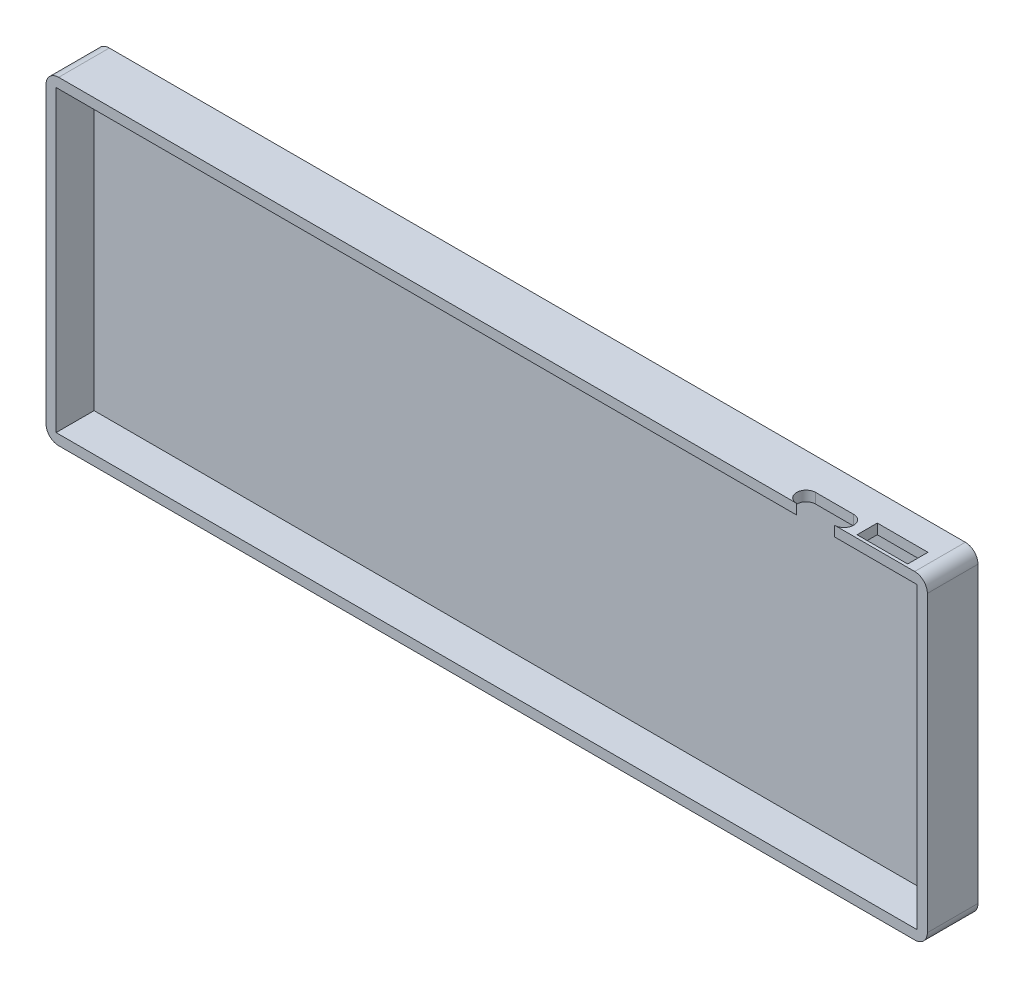
ISO-10303-21;
HEADER;
FILE_DESCRIPTION(('STEP AP214'),'2;1');
FILE_NAME('part.step','',(''),(''),'','','');
FILE_SCHEMA(('AUTOMOTIVE_DESIGN { 1 0 10303 214 1 1 1 1 }'));
ENDSEC;
DATA;
#1=APPLICATION_CONTEXT('core data for automotive mechanical design processes');
#2=APPLICATION_PROTOCOL_DEFINITION('international standard','automotive_design',2000,#1);
#3=PRODUCT_CONTEXT('',#1,'mechanical');
#4=PRODUCT('Part','Part','',(#3));
#5=PRODUCT_RELATED_PRODUCT_CATEGORY('part','',(#4));
#6=PRODUCT_DEFINITION_FORMATION('','',#4);
#7=PRODUCT_DEFINITION_CONTEXT('part definition',#1,'design');
#8=PRODUCT_DEFINITION('design','',#6,#7);
#9=PRODUCT_DEFINITION_SHAPE('','',#8);
#10=(LENGTH_UNIT() NAMED_UNIT(*) SI_UNIT(.MILLI.,.METRE.));
#11=(NAMED_UNIT(*) PLANE_ANGLE_UNIT() SI_UNIT($,.RADIAN.));
#12=(NAMED_UNIT(*) SI_UNIT($,.STERADIAN.) SOLID_ANGLE_UNIT());
#13=UNCERTAINTY_MEASURE_WITH_UNIT(LENGTH_MEASURE(1.E-05),#10,'distance_accuracy_value','');
#14=(GEOMETRIC_REPRESENTATION_CONTEXT(3) GLOBAL_UNCERTAINTY_ASSIGNED_CONTEXT((#13)) GLOBAL_UNIT_ASSIGNED_CONTEXT((#10,
#11,#12)) REPRESENTATION_CONTEXT('',''));
#15=CARTESIAN_POINT('',(0.,0.,0.));
#16=DIRECTION('',(0.,0.,1.));
#17=DIRECTION('',(1.,0.,0.));
#18=AXIS2_PLACEMENT_3D('',#15,#16,#17);
#19=CARTESIAN_POINT('',(-174.,63.,20.));
#20=DIRECTION('',(1.,0.,0.));
#21=DIRECTION('',(0.,1.,0.));
#22=AXIS2_PLACEMENT_3D('',#19,#20,#21);
#23=PLANE('',#22);
#24=DIRECTION('',(0.,-1.,0.));
#25=VECTOR('',#24,1.);
#26=CARTESIAN_POINT('',(-174.,63.,20.));
#27=LINE('',#26,#25);
#28=CARTESIAN_POINT('',(-174.,58.,20.));
#29=VERTEX_POINT('',#28);
#30=CARTESIAN_POINT('',(-174.,-58.,20.));
#31=VERTEX_POINT('',#30);
#32=EDGE_CURVE('E281',#29,#31,#27,.T.);
#33=ORIENTED_EDGE('',*,*,#32,.F.);
#34=DIRECTION('',(0.,0.,-1.));
#35=VECTOR('',#34,1.);
#36=CARTESIAN_POINT('',(-174.,58.,20.));
#37=LINE('',#36,#35);
#38=CARTESIAN_POINT('',(-174.,58.,0.));
#39=VERTEX_POINT('',#38);
#40=EDGE_CURVE('E303',#29,#39,#37,.T.);
#41=ORIENTED_EDGE('',*,*,#40,.T.);
#42=DIRECTION('',(0.,-1.,0.));
#43=VECTOR('',#42,1.);
#44=CARTESIAN_POINT('',(-174.,63.,0.));
#45=LINE('',#44,#43);
#46=CARTESIAN_POINT('',(-174.,-58.,0.));
#47=VERTEX_POINT('',#46);
#48=EDGE_CURVE('E274',#39,#47,#45,.T.);
#49=ORIENTED_EDGE('',*,*,#48,.T.);
#50=DIRECTION('',(0.,0.,-1.));
#51=VECTOR('',#50,1.);
#52=CARTESIAN_POINT('',(-174.,-58.,20.));
#53=LINE('',#52,#51);
#54=EDGE_CURVE('E292',#47,#31,#53,.F.);
#55=ORIENTED_EDGE('',*,*,#54,.T.);
#56=EDGE_LOOP('',(#33,#41,#49,#55));
#57=FACE_BOUND('',#56,.T.);
#58=ADVANCED_FACE('F39',(#57),#23,.F.);
#59=CARTESIAN_POINT('',(174.,-63.,20.));
#60=DIRECTION('',(0.,1.,0.));
#61=DIRECTION('',(-1.,0.,0.));
#62=AXIS2_PLACEMENT_3D('',#59,#60,#61);
#63=PLANE('',#62);
#64=DIRECTION('',(1.,0.,0.));
#65=VECTOR('',#64,1.);
#66=CARTESIAN_POINT('',(174.,-63.,20.));
#67=LINE('',#66,#65);
#68=CARTESIAN_POINT('',(-169.,-63.,20.));
#69=VERTEX_POINT('',#68);
#70=CARTESIAN_POINT('',(169.,-63.,20.));
#71=VERTEX_POINT('',#70);
#72=EDGE_CURVE('E284',#69,#71,#67,.T.);
#73=ORIENTED_EDGE('',*,*,#72,.F.);
#74=DIRECTION('',(0.,0.,-1.));
#75=VECTOR('',#74,1.);
#76=CARTESIAN_POINT('',(-169.,-63.,20.));
#77=LINE('',#76,#75);
#78=CARTESIAN_POINT('',(-169.,-63.,0.));
#79=VERTEX_POINT('',#78);
#80=EDGE_CURVE('E328',#69,#79,#77,.T.);
#81=ORIENTED_EDGE('',*,*,#80,.T.);
#82=DIRECTION('',(1.,0.,0.));
#83=VECTOR('',#82,1.);
#84=CARTESIAN_POINT('',(174.,-63.,0.));
#85=LINE('',#84,#83);
#86=CARTESIAN_POINT('',(169.,-63.,0.));
#87=VERTEX_POINT('',#86);
#88=EDGE_CURVE('E295',#79,#87,#85,.T.);
#89=ORIENTED_EDGE('',*,*,#88,.T.);
#90=DIRECTION('',(0.,0.,-1.));
#91=VECTOR('',#90,1.);
#92=CARTESIAN_POINT('',(169.,-63.,20.));
#93=LINE('',#92,#91);
#94=EDGE_CURVE('E326',#87,#71,#93,.F.);
#95=ORIENTED_EDGE('',*,*,#94,.T.);
#96=EDGE_LOOP('',(#73,#81,#89,#95));
#97=FACE_BOUND('',#96,.T.);
#98=ADVANCED_FACE('F334',(#97),#63,.F.);
#99=CARTESIAN_POINT('',(174.,63.,20.));
#100=DIRECTION('',(-1.,0.,0.));
#101=DIRECTION('',(0.,0.,1.));
#102=AXIS2_PLACEMENT_3D('',#99,#100,#101);
#103=PLANE('',#102);
#104=DIRECTION('',(0.,1.,0.));
#105=VECTOR('',#104,1.);
#106=CARTESIAN_POINT('',(174.,63.,20.));
#107=LINE('',#106,#105);
#108=CARTESIAN_POINT('',(174.,-58.,20.));
#109=VERTEX_POINT('',#108);
#110=CARTESIAN_POINT('',(174.,58.,20.));
#111=VERTEX_POINT('',#110);
#112=EDGE_CURVE('E287',#109,#111,#107,.T.);
#113=ORIENTED_EDGE('',*,*,#112,.F.);
#114=DIRECTION('',(0.,0.,-1.));
#115=VECTOR('',#114,1.);
#116=CARTESIAN_POINT('',(174.,-58.,20.));
#117=LINE('',#116,#115);
#118=CARTESIAN_POINT('',(174.,-58.,0.));
#119=VERTEX_POINT('',#118);
#120=EDGE_CURVE('E11',#109,#119,#117,.T.);
#121=ORIENTED_EDGE('',*,*,#120,.T.);
#122=DIRECTION('',(0.,1.,0.));
#123=VECTOR('',#122,1.);
#124=CARTESIAN_POINT('',(174.,63.,0.));
#125=LINE('',#124,#123);
#126=CARTESIAN_POINT('',(174.,58.,0.));
#127=VERTEX_POINT('',#126);
#128=EDGE_CURVE('E298',#119,#127,#125,.T.);
#129=ORIENTED_EDGE('',*,*,#128,.T.);
#130=DIRECTION('',(0.,0.,-1.));
#131=VECTOR('',#130,1.);
#132=CARTESIAN_POINT('',(174.,58.,20.));
#133=LINE('',#132,#131);
#134=EDGE_CURVE('E47',#127,#111,#133,.F.);
#135=ORIENTED_EDGE('',*,*,#134,.T.);
#136=EDGE_LOOP('',(#113,#121,#129,#135));
#137=FACE_BOUND('',#136,.T.);
#138=ADVANCED_FACE('F345',(#137),#103,.F.);
#139=CARTESIAN_POINT('',(174.,63.,20.));
#140=DIRECTION('',(0.,-1.,0.));
#141=DIRECTION('',(1.,0.,0.));
#142=AXIS2_PLACEMENT_3D('',#139,#140,#141);
#143=PLANE('',#142);
#144=DIRECTION('',(1.,0.,0.));
#145=VECTOR('',#144,1.);
#146=CARTESIAN_POINT('',(145.05,63.,18.81));
#147=LINE('',#146,#145);
#148=CARTESIAN_POINT('',(145.05,63.,18.81));
#149=VERTEX_POINT('',#148);
#150=CARTESIAN_POINT('',(165.05,63.,18.81));
#151=VERTEX_POINT('',#150);
#152=EDGE_CURVE('E205',#149,#151,#147,.T.);
#153=ORIENTED_EDGE('',*,*,#152,.F.);
#154=DIRECTION('',(0.,0.,1.));
#155=VECTOR('',#154,1.);
#156=CARTESIAN_POINT('',(145.05,63.,10.81));
#157=LINE('',#156,#155);
#158=CARTESIAN_POINT('',(145.05,63.,10.81));
#159=VERTEX_POINT('',#158);
#160=EDGE_CURVE('E184',#159,#149,#157,.T.);
#161=ORIENTED_EDGE('',*,*,#160,.F.);
#162=DIRECTION('',(-1.,0.,0.));
#163=VECTOR('',#162,1.);
#164=CARTESIAN_POINT('',(145.05,63.,10.81));
#165=LINE('',#164,#163);
#166=CARTESIAN_POINT('',(165.05,63.,10.81));
#167=VERTEX_POINT('',#166);
#168=EDGE_CURVE('E189',#167,#159,#165,.T.);
#169=ORIENTED_EDGE('',*,*,#168,.F.);
#170=DIRECTION('',(0.,0.,-1.));
#171=VECTOR('',#170,1.);
#172=CARTESIAN_POINT('',(165.05,63.,10.81));
#173=LINE('',#172,#171);
#174=EDGE_CURVE('E212',#151,#167,#173,.T.);
#175=ORIENTED_EDGE('',*,*,#174,.F.);
#176=EDGE_LOOP('',(#153,#161,#169,#175));
#177=FACE_BOUND('',#176,.T.);
#178=DIRECTION('',(-1.,0.,0.));
#179=VECTOR('',#178,1.);
#180=CARTESIAN_POINT('',(174.,63.,0.));
#181=LINE('',#180,#179);
#182=CARTESIAN_POINT('',(169.,63.,0.));
#183=VERTEX_POINT('',#182);
#184=CARTESIAN_POINT('',(-169.,63.,0.));
#185=VERTEX_POINT('',#184);
#186=EDGE_CURVE('E285',#183,#185,#181,.T.);
#187=ORIENTED_EDGE('',*,*,#186,.T.);
#188=DIRECTION('',(0.,0.,-1.));
#189=VECTOR('',#188,1.);
#190=CARTESIAN_POINT('',(-169.,63.,20.));
#191=LINE('',#190,#189);
#192=CARTESIAN_POINT('',(-169.,63.,20.));
#193=VERTEX_POINT('',#192);
#194=EDGE_CURVE('E317',#185,#193,#191,.F.);
#195=ORIENTED_EDGE('',*,*,#194,.T.);
#196=DIRECTION('',(-1.,0.,0.));
#197=VECTOR('',#196,1.);
#198=CARTESIAN_POINT('',(174.,63.,20.));
#199=LINE('',#198,#197);
#200=CARTESIAN_POINT('',(122.39,63.,20.));
#201=VERTEX_POINT('',#200);
#202=EDGE_CURVE('E289',#201,#193,#199,.T.);
#203=ORIENTED_EDGE('',*,*,#202,.F.);
#204=CARTESIAN_POINT('',(122.39,63.,16.25));
#205=DIRECTION('',(0.,1.,0.));
#206=DIRECTION('',(-1.,0.,0.));
#207=AXIS2_PLACEMENT_3D('',#204,#205,#206);
#208=CIRCLE('',#207,3.75);
#209=CARTESIAN_POINT('',(122.39,63.,12.5));
#210=VERTEX_POINT('',#209);
#211=EDGE_CURVE('E228',#210,#201,#208,.T.);
#212=ORIENTED_EDGE('',*,*,#211,.F.);
#213=DIRECTION('',(1.,0.,0.));
#214=VECTOR('',#213,1.);
#215=CARTESIAN_POINT('',(122.39,63.,12.5));
#216=LINE('',#215,#214);
#217=CARTESIAN_POINT('',(137.39,63.,12.5));
#218=VERTEX_POINT('',#217);
#219=EDGE_CURVE('E233',#210,#218,#216,.T.);
#220=ORIENTED_EDGE('',*,*,#219,.T.);
#221=CARTESIAN_POINT('',(137.39,63.,16.25));
#222=DIRECTION('',(0.,1.,0.));
#223=DIRECTION('',(-1.,0.,0.));
#224=AXIS2_PLACEMENT_3D('',#221,#222,#223);
#225=CIRCLE('',#224,3.75);
#226=CARTESIAN_POINT('',(137.39,63.,20.));
#227=VERTEX_POINT('',#226);
#228=EDGE_CURVE('E230',#227,#218,#225,.T.);
#229=ORIENTED_EDGE('',*,*,#228,.F.);
#230=CARTESIAN_POINT('',(169.,63.,20.));
#231=VERTEX_POINT('',#230);
#232=EDGE_CURVE('E290',#231,#227,#199,.T.);
#233=ORIENTED_EDGE('',*,*,#232,.F.);
#234=DIRECTION('',(0.,0.,-1.));
#235=VECTOR('',#234,1.);
#236=CARTESIAN_POINT('',(169.,63.,20.));
#237=LINE('',#236,#235);
#238=EDGE_CURVE('E314',#231,#183,#237,.T.);
#239=ORIENTED_EDGE('',*,*,#238,.T.);
#240=EDGE_LOOP('',(#187,#195,#203,#212,#220,#229,#233,#239));
#241=FACE_BOUND('',#240,.T.);
#242=ADVANCED_FACE('F354',(#177,#241),#143,.F.);
#243=CARTESIAN_POINT('',(0.,0.,20.));
#244=DIRECTION('',(0.,0.,-1.));
#245=DIRECTION('',(-1.,0.,0.));
#246=AXIS2_PLACEMENT_3D('',#243,#244,#245);
#247=PLANE('',#246);
#248=ORIENTED_EDGE('',*,*,#202,.T.);
#249=CARTESIAN_POINT('',(-169.,58.,20.));
#250=DIRECTION('',(0.,0.,-1.));
#251=DIRECTION('',(-1.,0.,0.));
#252=AXIS2_PLACEMENT_3D('',#249,#250,#251);
#253=CIRCLE('',#252,5.);
#254=EDGE_CURVE('E324',#193,#29,#253,.F.);
#255=ORIENTED_EDGE('',*,*,#254,.T.);
#256=ORIENTED_EDGE('',*,*,#32,.T.);
#257=CARTESIAN_POINT('',(-169.,-58.,20.));
#258=DIRECTION('',(0.,0.,-1.));
#259=DIRECTION('',(-1.,0.,0.));
#260=AXIS2_PLACEMENT_3D('',#257,#258,#259);
#261=CIRCLE('',#260,5.);
#262=EDGE_CURVE('E322',#31,#69,#261,.F.);
#263=ORIENTED_EDGE('',*,*,#262,.T.);
#264=ORIENTED_EDGE('',*,*,#72,.T.);
#265=CARTESIAN_POINT('',(169.,-58.,20.));
#266=DIRECTION('',(0.,0.,-1.));
#267=DIRECTION('',(-1.,0.,0.));
#268=AXIS2_PLACEMENT_3D('',#265,#266,#267);
#269=CIRCLE('',#268,5.);
#270=EDGE_CURVE('E60',#71,#109,#269,.F.);
#271=ORIENTED_EDGE('',*,*,#270,.T.);
#272=ORIENTED_EDGE('',*,*,#112,.T.);
#273=CARTESIAN_POINT('',(169.,58.,20.));
#274=DIRECTION('',(0.,0.,-1.));
#275=DIRECTION('',(-1.,0.,0.));
#276=AXIS2_PLACEMENT_3D('',#273,#274,#275);
#277=CIRCLE('',#276,5.);
#278=EDGE_CURVE('E319',#111,#231,#277,.F.);
#279=ORIENTED_EDGE('',*,*,#278,.T.);
#280=ORIENTED_EDGE('',*,*,#232,.T.);
#281=DIRECTION('',(0.,1.,0.));
#282=VECTOR('',#281,1.);
#283=CARTESIAN_POINT('',(137.39,-63.001,20.));
#284=LINE('',#283,#282);
#285=CARTESIAN_POINT('',(137.39,59.,20.));
#286=VERTEX_POINT('',#285);
#287=EDGE_CURVE('E242',#286,#227,#284,.T.);
#288=ORIENTED_EDGE('',*,*,#287,.F.);
#289=DIRECTION('',(-1.,0.,0.));
#290=VECTOR('',#289,1.);
#291=CARTESIAN_POINT('',(170.,59.,20.));
#292=LINE('',#291,#290);
#293=CARTESIAN_POINT('',(170.,59.,20.));
#294=VERTEX_POINT('',#293);
#295=EDGE_CURVE('E251',#294,#286,#292,.T.);
#296=ORIENTED_EDGE('',*,*,#295,.F.);
#297=DIRECTION('',(0.,1.,0.));
#298=VECTOR('',#297,1.);
#299=CARTESIAN_POINT('',(170.,59.,20.));
#300=LINE('',#299,#298);
#301=CARTESIAN_POINT('',(170.,-59.,20.));
#302=VERTEX_POINT('',#301);
#303=EDGE_CURVE('E265',#302,#294,#300,.T.);
#304=ORIENTED_EDGE('',*,*,#303,.F.);
#305=DIRECTION('',(1.,0.,0.));
#306=VECTOR('',#305,1.);
#307=CARTESIAN_POINT('',(170.,-59.,20.));
#308=LINE('',#307,#306);
#309=CARTESIAN_POINT('',(-170.,-59.,20.));
#310=VERTEX_POINT('',#309);
#311=EDGE_CURVE('E262',#310,#302,#308,.T.);
#312=ORIENTED_EDGE('',*,*,#311,.F.);
#313=DIRECTION('',(0.,-1.,0.));
#314=VECTOR('',#313,1.);
#315=CARTESIAN_POINT('',(-170.,59.,20.));
#316=LINE('',#315,#314);
#317=CARTESIAN_POINT('',(-170.,59.,20.));
#318=VERTEX_POINT('',#317);
#319=EDGE_CURVE('E239',#318,#310,#316,.T.);
#320=ORIENTED_EDGE('',*,*,#319,.F.);
#321=CARTESIAN_POINT('',(122.39,59.,20.));
#322=VERTEX_POINT('',#321);
#323=EDGE_CURVE('E268',#322,#318,#292,.T.);
#324=ORIENTED_EDGE('',*,*,#323,.F.);
#325=DIRECTION('',(0.,1.,0.));
#326=VECTOR('',#325,1.);
#327=CARTESIAN_POINT('',(122.39,-63.001,20.));
#328=LINE('',#327,#326);
#329=EDGE_CURVE('E236',#322,#201,#328,.T.);
#330=ORIENTED_EDGE('',*,*,#329,.T.);
#331=EDGE_LOOP('',(#248,#255,#256,#263,#264,#271,#272,#279,#280,#288,#296,#304,#312,#320,#324,#330));
#332=FACE_BOUND('',#331,.T.);
#333=ADVANCED_FACE('F348',(#332),#247,.F.);
#334=CARTESIAN_POINT('',(0.,0.,0.));
#335=DIRECTION('',(0.,0.,-1.));
#336=DIRECTION('',(-1.,0.,0.));
#337=AXIS2_PLACEMENT_3D('',#334,#335,#336);
#338=PLANE('',#337);
#339=ORIENTED_EDGE('',*,*,#48,.F.);
#340=CARTESIAN_POINT('',(-169.,58.,0.));
#341=DIRECTION('',(0.,0.,-1.));
#342=DIRECTION('',(-1.,0.,0.));
#343=AXIS2_PLACEMENT_3D('',#340,#341,#342);
#344=CIRCLE('',#343,5.);
#345=EDGE_CURVE('E312',#39,#185,#344,.T.);
#346=ORIENTED_EDGE('',*,*,#345,.T.);
#347=ORIENTED_EDGE('',*,*,#186,.F.);
#348=CARTESIAN_POINT('',(169.,58.,0.));
#349=DIRECTION('',(0.,0.,-1.));
#350=DIRECTION('',(-1.,0.,0.));
#351=AXIS2_PLACEMENT_3D('',#348,#349,#350);
#352=CIRCLE('',#351,5.);
#353=EDGE_CURVE('E306',#183,#127,#352,.T.);
#354=ORIENTED_EDGE('',*,*,#353,.T.);
#355=ORIENTED_EDGE('',*,*,#128,.F.);
#356=CARTESIAN_POINT('',(169.,-58.,0.));
#357=DIRECTION('',(0.,0.,-1.));
#358=DIRECTION('',(-1.,0.,0.));
#359=AXIS2_PLACEMENT_3D('',#356,#357,#358);
#360=CIRCLE('',#359,5.);
#361=EDGE_CURVE('E308',#119,#87,#360,.T.);
#362=ORIENTED_EDGE('',*,*,#361,.T.);
#363=ORIENTED_EDGE('',*,*,#88,.F.);
#364=CARTESIAN_POINT('',(-169.,-58.,0.));
#365=DIRECTION('',(0.,0.,-1.));
#366=DIRECTION('',(-1.,0.,0.));
#367=AXIS2_PLACEMENT_3D('',#364,#365,#366);
#368=CIRCLE('',#367,5.);
#369=EDGE_CURVE('E310',#79,#47,#368,.T.);
#370=ORIENTED_EDGE('',*,*,#369,.T.);
#371=EDGE_LOOP('',(#339,#346,#347,#354,#355,#362,#363,#370));
#372=FACE_BOUND('',#371,.T.);
#373=ADVANCED_FACE('F340',(#372),#338,.T.);
#374=CARTESIAN_POINT('',(-170.,59.,5.));
#375=DIRECTION('',(-1.,0.,0.));
#376=DIRECTION('',(0.,-1.,0.));
#377=AXIS2_PLACEMENT_3D('',#374,#375,#376);
#378=PLANE('',#377);
#379=ORIENTED_EDGE('',*,*,#319,.T.);
#380=DIRECTION('',(0.,0.,1.));
#381=VECTOR('',#380,1.);
#382=CARTESIAN_POINT('',(-170.,-59.,5.));
#383=LINE('',#382,#381);
#384=CARTESIAN_POINT('',(-170.,-59.,5.));
#385=VERTEX_POINT('',#384);
#386=EDGE_CURVE('E260',#385,#310,#383,.T.);
#387=ORIENTED_EDGE('',*,*,#386,.F.);
#388=DIRECTION('',(0.,-1.,0.));
#389=VECTOR('',#388,1.);
#390=CARTESIAN_POINT('',(-170.,59.,5.));
#391=LINE('',#390,#389);
#392=CARTESIAN_POINT('',(-170.,59.,5.));
#393=VERTEX_POINT('',#392);
#394=EDGE_CURVE('E247',#393,#385,#391,.T.);
#395=ORIENTED_EDGE('',*,*,#394,.F.);
#396=DIRECTION('',(0.,0.,1.));
#397=VECTOR('',#396,1.);
#398=CARTESIAN_POINT('',(-170.,59.,5.));
#399=LINE('',#398,#397);
#400=EDGE_CURVE('E271',#393,#318,#399,.T.);
#401=ORIENTED_EDGE('',*,*,#400,.T.);
#402=EDGE_LOOP('',(#379,#387,#395,#401));
#403=FACE_BOUND('',#402,.T.);
#404=ADVANCED_FACE('F387',(#403),#378,.F.);
#405=CARTESIAN_POINT('',(170.,59.,5.));
#406=DIRECTION('',(0.,1.,0.));
#407=DIRECTION('',(-1.,0.,0.));
#408=AXIS2_PLACEMENT_3D('',#405,#406,#407);
#409=PLANE('',#408);
#410=DIRECTION('',(1.,0.,0.));
#411=VECTOR('',#410,1.);
#412=CARTESIAN_POINT('',(145.05,59.,10.81));
#413=LINE('',#412,#411);
#414=CARTESIAN_POINT('',(145.05,59.,10.81));
#415=VERTEX_POINT('',#414);
#416=CARTESIAN_POINT('',(165.05,59.,10.81));
#417=VERTEX_POINT('',#416);
#418=EDGE_CURVE('E203',#415,#417,#413,.T.);
#419=ORIENTED_EDGE('',*,*,#418,.F.);
#420=DIRECTION('',(0.,0.,-1.));
#421=VECTOR('',#420,1.);
#422=CARTESIAN_POINT('',(145.05,59.,10.81));
#423=LINE('',#422,#421);
#424=CARTESIAN_POINT('',(145.05,59.,18.81));
#425=VERTEX_POINT('',#424);
#426=EDGE_CURVE('E181',#425,#415,#423,.T.);
#427=ORIENTED_EDGE('',*,*,#426,.F.);
#428=DIRECTION('',(-1.,0.,0.));
#429=VECTOR('',#428,1.);
#430=CARTESIAN_POINT('',(145.05,59.,18.81));
#431=LINE('',#430,#429);
#432=CARTESIAN_POINT('',(165.05,59.,18.81));
#433=VERTEX_POINT('',#432);
#434=EDGE_CURVE('E193',#433,#425,#431,.T.);
#435=ORIENTED_EDGE('',*,*,#434,.F.);
#436=DIRECTION('',(0.,0.,1.));
#437=VECTOR('',#436,1.);
#438=CARTESIAN_POINT('',(165.05,59.,10.81));
#439=LINE('',#438,#437);
#440=EDGE_CURVE('E207',#417,#433,#439,.T.);
#441=ORIENTED_EDGE('',*,*,#440,.F.);
#442=EDGE_LOOP('',(#419,#427,#435,#441));
#443=FACE_BOUND('',#442,.T.);
#444=DIRECTION('',(-1.,0.,0.));
#445=VECTOR('',#444,1.);
#446=CARTESIAN_POINT('',(122.39,59.,12.5));
#447=LINE('',#446,#445);
#448=CARTESIAN_POINT('',(137.39,59.,12.5));
#449=VERTEX_POINT('',#448);
#450=CARTESIAN_POINT('',(122.39,59.,12.5));
#451=VERTEX_POINT('',#450);
#452=EDGE_CURVE('E222',#449,#451,#447,.T.);
#453=ORIENTED_EDGE('',*,*,#452,.T.);
#454=CARTESIAN_POINT('',(122.39,59.,16.25));
#455=DIRECTION('',(0.,1.,0.));
#456=DIRECTION('',(-1.,0.,0.));
#457=AXIS2_PLACEMENT_3D('',#454,#455,#456);
#458=CIRCLE('',#457,3.75);
#459=EDGE_CURVE('E225',#322,#451,#458,.F.);
#460=ORIENTED_EDGE('',*,*,#459,.F.);
#461=ORIENTED_EDGE('',*,*,#323,.T.);
#462=ORIENTED_EDGE('',*,*,#400,.F.);
#463=DIRECTION('',(-1.,0.,0.));
#464=VECTOR('',#463,1.);
#465=CARTESIAN_POINT('',(170.,59.,5.));
#466=LINE('',#465,#464);
#467=CARTESIAN_POINT('',(170.,59.,5.));
#468=VERTEX_POINT('',#467);
#469=EDGE_CURVE('E257',#468,#393,#466,.T.);
#470=ORIENTED_EDGE('',*,*,#469,.F.);
#471=DIRECTION('',(0.,0.,1.));
#472=VECTOR('',#471,1.);
#473=CARTESIAN_POINT('',(170.,59.,5.));
#474=LINE('',#473,#472);
#475=EDGE_CURVE('E275',#468,#294,#474,.T.);
#476=ORIENTED_EDGE('',*,*,#475,.T.);
#477=ORIENTED_EDGE('',*,*,#295,.T.);
#478=CARTESIAN_POINT('',(137.39,59.,16.25));
#479=DIRECTION('',(0.,1.,0.));
#480=DIRECTION('',(-1.,0.,0.));
#481=AXIS2_PLACEMENT_3D('',#478,#479,#480);
#482=CIRCLE('',#481,3.75);
#483=EDGE_CURVE('E197',#449,#286,#482,.F.);
#484=ORIENTED_EDGE('',*,*,#483,.F.);
#485=EDGE_LOOP('',(#453,#460,#461,#462,#470,#476,#477,#484));
#486=FACE_BOUND('',#485,.T.);
#487=ADVANCED_FACE('F200',(#443,#486),#409,.F.);
#488=CARTESIAN_POINT('',(170.,59.,5.));
#489=DIRECTION('',(1.,0.,0.));
#490=DIRECTION('',(0.,0.,-1.));
#491=AXIS2_PLACEMENT_3D('',#488,#489,#490);
#492=PLANE('',#491);
#493=ORIENTED_EDGE('',*,*,#303,.T.);
#494=ORIENTED_EDGE('',*,*,#475,.F.);
#495=DIRECTION('',(0.,1.,0.));
#496=VECTOR('',#495,1.);
#497=CARTESIAN_POINT('',(170.,59.,5.));
#498=LINE('',#497,#496);
#499=CARTESIAN_POINT('',(170.,-59.,5.));
#500=VERTEX_POINT('',#499);
#501=EDGE_CURVE('E254',#500,#468,#498,.T.);
#502=ORIENTED_EDGE('',*,*,#501,.F.);
#503=DIRECTION('',(0.,0.,1.));
#504=VECTOR('',#503,1.);
#505=CARTESIAN_POINT('',(170.,-59.,5.));
#506=LINE('',#505,#504);
#507=EDGE_CURVE('E277',#500,#302,#506,.T.);
#508=ORIENTED_EDGE('',*,*,#507,.T.);
#509=EDGE_LOOP('',(#493,#494,#502,#508));
#510=FACE_BOUND('',#509,.T.);
#511=ADVANCED_FACE('F397',(#510),#492,.F.);
#512=CARTESIAN_POINT('',(170.,-59.,5.));
#513=DIRECTION('',(0.,-1.,0.));
#514=DIRECTION('',(1.,0.,0.));
#515=AXIS2_PLACEMENT_3D('',#512,#513,#514);
#516=PLANE('',#515);
#517=ORIENTED_EDGE('',*,*,#311,.T.);
#518=ORIENTED_EDGE('',*,*,#507,.F.);
#519=DIRECTION('',(1.,0.,0.));
#520=VECTOR('',#519,1.);
#521=CARTESIAN_POINT('',(170.,-59.,5.));
#522=LINE('',#521,#520);
#523=EDGE_CURVE('E250',#385,#500,#522,.T.);
#524=ORIENTED_EDGE('',*,*,#523,.F.);
#525=ORIENTED_EDGE('',*,*,#386,.T.);
#526=EDGE_LOOP('',(#517,#518,#524,#525));
#527=FACE_BOUND('',#526,.T.);
#528=ADVANCED_FACE('F393',(#527),#516,.F.);
#529=CARTESIAN_POINT('',(0.,0.,5.));
#530=DIRECTION('',(0.,0.,-1.));
#531=DIRECTION('',(-1.,0.,0.));
#532=AXIS2_PLACEMENT_3D('',#529,#530,#531);
#533=PLANE('',#532);
#534=ORIENTED_EDGE('',*,*,#394,.T.);
#535=ORIENTED_EDGE('',*,*,#523,.T.);
#536=ORIENTED_EDGE('',*,*,#501,.T.);
#537=ORIENTED_EDGE('',*,*,#469,.T.);
#538=EDGE_LOOP('',(#534,#535,#536,#537));
#539=FACE_BOUND('',#538,.T.);
#540=ADVANCED_FACE('F396',(#539),#533,.F.);
#541=CARTESIAN_POINT('',(122.39,-63.001,16.25));
#542=DIRECTION('',(0.,1.,0.));
#543=DIRECTION('',(-1.,0.,0.));
#544=AXIS2_PLACEMENT_3D('',#541,#542,#543);
#545=CYLINDRICAL_SURFACE('',#544,3.75);
#546=ORIENTED_EDGE('',*,*,#459,.T.);
#547=DIRECTION('',(0.,1.,0.));
#548=VECTOR('',#547,1.);
#549=CARTESIAN_POINT('',(122.39,-63.001,12.5));
#550=LINE('',#549,#548);
#551=EDGE_CURVE('E237',#451,#210,#550,.T.);
#552=ORIENTED_EDGE('',*,*,#551,.T.);
#553=ORIENTED_EDGE('',*,*,#211,.T.);
#554=ORIENTED_EDGE('',*,*,#329,.F.);
#555=EDGE_LOOP('',(#546,#552,#553,#554));
#556=FACE_BOUND('',#555,.T.);
#557=ADVANCED_FACE('F406',(#556),#545,.F.);
#558=CARTESIAN_POINT('',(122.39,-63.001,12.5));
#559=DIRECTION('',(0.,0.,1.));
#560=DIRECTION('',(1.,0.,0.));
#561=AXIS2_PLACEMENT_3D('',#558,#559,#560);
#562=PLANE('',#561);
#563=DIRECTION('',(0.,1.,0.));
#564=VECTOR('',#563,1.);
#565=CARTESIAN_POINT('',(137.39,-63.001,12.5));
#566=LINE('',#565,#564);
#567=EDGE_CURVE('E240',#449,#218,#566,.T.);
#568=ORIENTED_EDGE('',*,*,#567,.T.);
#569=ORIENTED_EDGE('',*,*,#219,.F.);
#570=ORIENTED_EDGE('',*,*,#551,.F.);
#571=ORIENTED_EDGE('',*,*,#452,.F.);
#572=EDGE_LOOP('',(#568,#569,#570,#571));
#573=FACE_BOUND('',#572,.T.);
#574=ADVANCED_FACE('F410',(#573),#562,.T.);
#575=CARTESIAN_POINT('',(137.39,-63.001,16.25));
#576=DIRECTION('',(0.,1.,0.));
#577=DIRECTION('',(-1.,0.,0.));
#578=AXIS2_PLACEMENT_3D('',#575,#576,#577);
#579=CYLINDRICAL_SURFACE('',#578,3.75);
#580=ORIENTED_EDGE('',*,*,#483,.T.);
#581=ORIENTED_EDGE('',*,*,#287,.T.);
#582=ORIENTED_EDGE('',*,*,#228,.T.);
#583=ORIENTED_EDGE('',*,*,#567,.F.);
#584=EDGE_LOOP('',(#580,#581,#582,#583));
#585=FACE_BOUND('',#584,.T.);
#586=ADVANCED_FACE('F412',(#585),#579,.F.);
#587=CARTESIAN_POINT('',(145.05,-63.001,10.81));
#588=DIRECTION('',(-1.,0.,0.));
#589=DIRECTION('',(0.,-1.,0.));
#590=AXIS2_PLACEMENT_3D('',#587,#588,#589);
#591=PLANE('',#590);
#592=ORIENTED_EDGE('',*,*,#426,.T.);
#593=DIRECTION('',(0.,1.,0.));
#594=VECTOR('',#593,1.);
#595=CARTESIAN_POINT('',(145.05,-63.001,10.81));
#596=LINE('',#595,#594);
#597=EDGE_CURVE('E198',#415,#159,#596,.T.);
#598=ORIENTED_EDGE('',*,*,#597,.T.);
#599=ORIENTED_EDGE('',*,*,#160,.T.);
#600=DIRECTION('',(0.,1.,0.));
#601=VECTOR('',#600,1.);
#602=CARTESIAN_POINT('',(145.05,-63.001,18.81));
#603=LINE('',#602,#601);
#604=EDGE_CURVE('E177',#425,#149,#603,.T.);
#605=ORIENTED_EDGE('',*,*,#604,.F.);
#606=EDGE_LOOP('',(#592,#598,#599,#605));
#607=FACE_BOUND('',#606,.T.);
#608=ADVANCED_FACE('F179',(#607),#591,.F.);
#609=CARTESIAN_POINT('',(145.05,-63.001,10.81));
#610=DIRECTION('',(0.,0.,-1.));
#611=DIRECTION('',(-1.,0.,0.));
#612=AXIS2_PLACEMENT_3D('',#609,#610,#611);
#613=PLANE('',#612);
#614=ORIENTED_EDGE('',*,*,#418,.T.);
#615=DIRECTION('',(0.,1.,0.));
#616=VECTOR('',#615,1.);
#617=CARTESIAN_POINT('',(165.05,-63.001,10.81));
#618=LINE('',#617,#616);
#619=EDGE_CURVE('E218',#417,#167,#618,.T.);
#620=ORIENTED_EDGE('',*,*,#619,.T.);
#621=ORIENTED_EDGE('',*,*,#168,.T.);
#622=ORIENTED_EDGE('',*,*,#597,.F.);
#623=EDGE_LOOP('',(#614,#620,#621,#622));
#624=FACE_BOUND('',#623,.T.);
#625=ADVANCED_FACE('F421',(#624),#613,.F.);
#626=CARTESIAN_POINT('',(165.05,-63.001,10.81));
#627=DIRECTION('',(1.,0.,0.));
#628=DIRECTION('',(0.,1.,0.));
#629=AXIS2_PLACEMENT_3D('',#626,#627,#628);
#630=PLANE('',#629);
#631=ORIENTED_EDGE('',*,*,#440,.T.);
#632=DIRECTION('',(0.,1.,0.));
#633=VECTOR('',#632,1.);
#634=CARTESIAN_POINT('',(165.05,-63.001,18.81));
#635=LINE('',#634,#633);
#636=EDGE_CURVE('E188',#433,#151,#635,.T.);
#637=ORIENTED_EDGE('',*,*,#636,.T.);
#638=ORIENTED_EDGE('',*,*,#174,.T.);
#639=ORIENTED_EDGE('',*,*,#619,.F.);
#640=EDGE_LOOP('',(#631,#637,#638,#639));
#641=FACE_BOUND('',#640,.T.);
#642=ADVANCED_FACE('F423',(#641),#630,.F.);
#643=CARTESIAN_POINT('',(145.05,-63.001,18.81));
#644=DIRECTION('',(0.,0.,1.));
#645=DIRECTION('',(1.,0.,0.));
#646=AXIS2_PLACEMENT_3D('',#643,#644,#645);
#647=PLANE('',#646);
#648=ORIENTED_EDGE('',*,*,#434,.T.);
#649=ORIENTED_EDGE('',*,*,#604,.T.);
#650=ORIENTED_EDGE('',*,*,#152,.T.);
#651=ORIENTED_EDGE('',*,*,#636,.F.);
#652=EDGE_LOOP('',(#648,#649,#650,#651));
#653=FACE_BOUND('',#652,.T.);
#654=ADVANCED_FACE('F194',(#653),#647,.F.);
#655=CARTESIAN_POINT('',(-169.,58.,20.));
#656=DIRECTION('',(0.,0.,-1.));
#657=DIRECTION('',(-1.,0.,0.));
#658=AXIS2_PLACEMENT_3D('',#655,#656,#657);
#659=CYLINDRICAL_SURFACE('',#658,5.);
#660=ORIENTED_EDGE('',*,*,#254,.F.);
#661=ORIENTED_EDGE('',*,*,#194,.F.);
#662=ORIENTED_EDGE('',*,*,#345,.F.);
#663=ORIENTED_EDGE('',*,*,#40,.F.);
#664=EDGE_LOOP('',(#660,#661,#662,#663));
#665=FACE_BOUND('',#664,.T.);
#666=ADVANCED_FACE('F360',(#665),#659,.T.);
#667=CARTESIAN_POINT('',(-169.,-58.,20.));
#668=DIRECTION('',(0.,0.,-1.));
#669=DIRECTION('',(-1.,0.,0.));
#670=AXIS2_PLACEMENT_3D('',#667,#668,#669);
#671=CYLINDRICAL_SURFACE('',#670,5.);
#672=ORIENTED_EDGE('',*,*,#262,.F.);
#673=ORIENTED_EDGE('',*,*,#54,.F.);
#674=ORIENTED_EDGE('',*,*,#369,.F.);
#675=ORIENTED_EDGE('',*,*,#80,.F.);
#676=EDGE_LOOP('',(#672,#673,#674,#675));
#677=FACE_BOUND('',#676,.T.);
#678=ADVANCED_FACE('F364',(#677),#671,.T.);
#679=CARTESIAN_POINT('',(169.,-58.,20.));
#680=DIRECTION('',(0.,0.,-1.));
#681=DIRECTION('',(-1.,0.,0.));
#682=AXIS2_PLACEMENT_3D('',#679,#680,#681);
#683=CYLINDRICAL_SURFACE('',#682,5.);
#684=ORIENTED_EDGE('',*,*,#270,.F.);
#685=ORIENTED_EDGE('',*,*,#94,.F.);
#686=ORIENTED_EDGE('',*,*,#361,.F.);
#687=ORIENTED_EDGE('',*,*,#120,.F.);
#688=EDGE_LOOP('',(#684,#685,#686,#687));
#689=FACE_BOUND('',#688,.T.);
#690=ADVANCED_FACE('F344',(#689),#683,.T.);
#691=CARTESIAN_POINT('',(169.,58.,20.));
#692=DIRECTION('',(0.,0.,-1.));
#693=DIRECTION('',(-1.,0.,0.));
#694=AXIS2_PLACEMENT_3D('',#691,#692,#693);
#695=CYLINDRICAL_SURFACE('',#694,5.);
#696=ORIENTED_EDGE('',*,*,#278,.F.);
#697=ORIENTED_EDGE('',*,*,#134,.F.);
#698=ORIENTED_EDGE('',*,*,#353,.F.);
#699=ORIENTED_EDGE('',*,*,#238,.F.);
#700=EDGE_LOOP('',(#696,#697,#698,#699));
#701=FACE_BOUND('',#700,.T.);
#702=ADVANCED_FACE('F41',(#701),#695,.T.);
#703=CLOSED_SHELL('',(#58,#98,#138,#242,#333,#373,#404,#487,#511,#528,#540,#557,#574,#586,#608,
#625,#642,#654,#666,#678,#690,#702));
#704=MANIFOLD_SOLID_BREP('B2',#703);
#705=ADVANCED_BREP_SHAPE_REPRESENTATION('',(#18,#704),#14);
#706=SHAPE_DEFINITION_REPRESENTATION(#9,#705);
ENDSEC;
END-ISO-10303-21;
